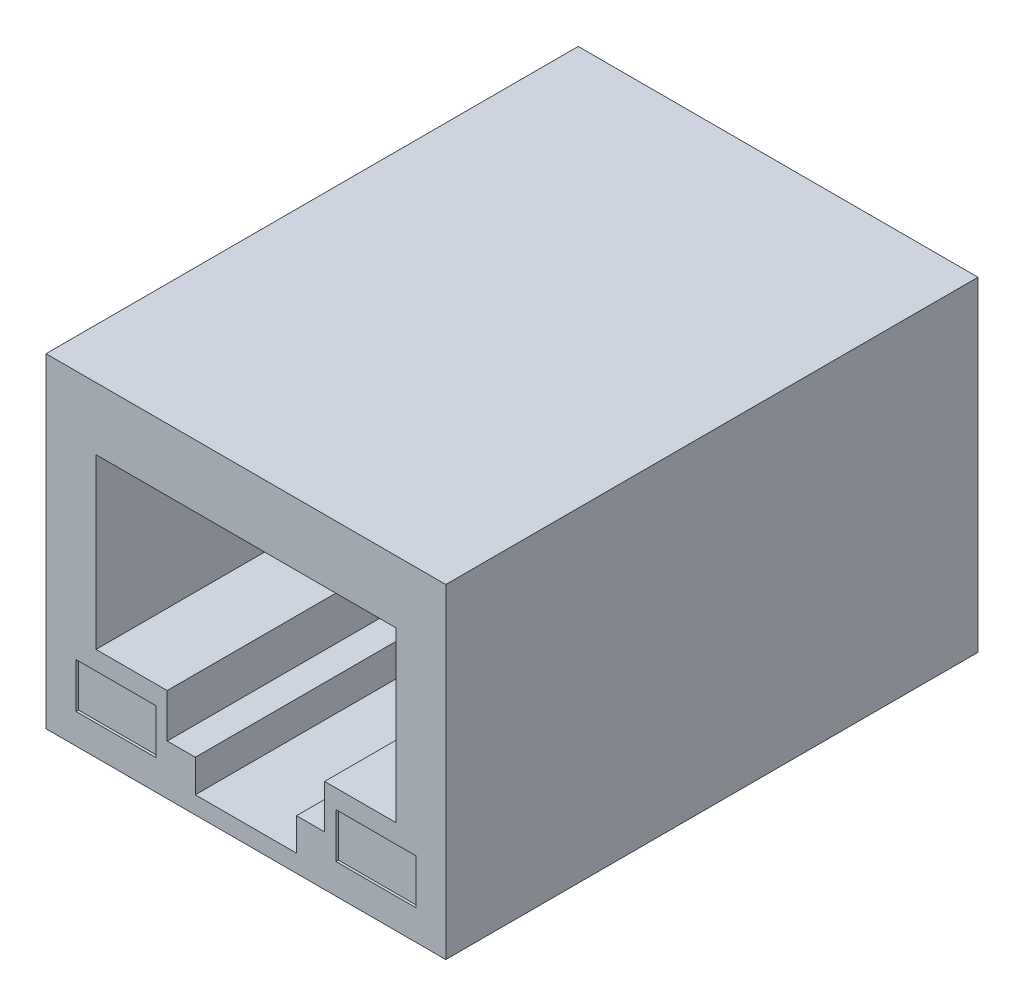
ISO-10303-21;
HEADER;
FILE_DESCRIPTION(('STEP AP214'),'2;1');
FILE_NAME('part.step','',(''),(''),'','','');
FILE_SCHEMA(('AUTOMOTIVE_DESIGN { 1 0 10303 214 1 1 1 1 }'));
ENDSEC;
DATA;
#1=APPLICATION_CONTEXT('core data for automotive mechanical design processes');
#2=APPLICATION_PROTOCOL_DEFINITION('international standard','automotive_design',2000,#1);
#3=PRODUCT_CONTEXT('',#1,'mechanical');
#4=PRODUCT('Part','Part','',(#3));
#5=PRODUCT_RELATED_PRODUCT_CATEGORY('part','',(#4));
#6=PRODUCT_DEFINITION_FORMATION('','',#4);
#7=PRODUCT_DEFINITION_CONTEXT('part definition',#1,'design');
#8=PRODUCT_DEFINITION('design','',#6,#7);
#9=PRODUCT_DEFINITION_SHAPE('','',#8);
#10=(LENGTH_UNIT() NAMED_UNIT(*) SI_UNIT(.MILLI.,.METRE.));
#11=(NAMED_UNIT(*) PLANE_ANGLE_UNIT() SI_UNIT($,.RADIAN.));
#12=(NAMED_UNIT(*) SI_UNIT($,.STERADIAN.) SOLID_ANGLE_UNIT());
#13=UNCERTAINTY_MEASURE_WITH_UNIT(LENGTH_MEASURE(1.E-05),#10,'distance_accuracy_value','');
#14=(GEOMETRIC_REPRESENTATION_CONTEXT(3) GLOBAL_UNCERTAINTY_ASSIGNED_CONTEXT((#13)) GLOBAL_UNIT_ASSIGNED_CONTEXT((#10,
#11,#12)) REPRESENTATION_CONTEXT('',''));
#15=CARTESIAN_POINT('',(0.,0.,0.));
#16=DIRECTION('',(0.,0.,1.));
#17=DIRECTION('',(1.,0.,0.));
#18=AXIS2_PLACEMENT_3D('',#15,#16,#17);
#19=CARTESIAN_POINT('',(-5.2,-8.4,-0.1));
#20=DIRECTION('',(0.,0.,1.));
#21=DIRECTION('',(1.,0.,0.));
#22=AXIS2_PLACEMENT_3D('',#19,#20,#21);
#23=PLANE('',#22);
#24=DIRECTION('',(0.,1.,0.));
#25=VECTOR('',#24,1.);
#26=CARTESIAN_POINT('',(-3.59999999999999,-9.3,-0.1));
#27=LINE('',#26,#25);
#28=CARTESIAN_POINT('',(-3.59999999999999,-9.3,-0.1));
#29=VERTEX_POINT('',#28);
#30=CARTESIAN_POINT('',(-3.59999999999999,-7.5,-0.1));
#31=VERTEX_POINT('',#30);
#32=EDGE_CURVE('E225',#29,#31,#27,.T.);
#33=ORIENTED_EDGE('',*,*,#32,.T.);
#34=DIRECTION('',(1.,0.,0.));
#35=VECTOR('',#34,1.);
#36=CARTESIAN_POINT('',(-3.59999999999999,-7.5,-0.1));
#37=LINE('',#36,#35);
#38=CARTESIAN_POINT('',(-6.8,-7.5,-0.1));
#39=VERTEX_POINT('',#38);
#40=EDGE_CURVE('E220',#31,#39,#37,.F.);
#41=ORIENTED_EDGE('',*,*,#40,.T.);
#42=DIRECTION('',(0.,1.,0.));
#43=VECTOR('',#42,1.);
#44=CARTESIAN_POINT('',(-6.8,-7.5,-0.1));
#45=LINE('',#44,#43);
#46=CARTESIAN_POINT('',(-6.8,-9.3,-0.1));
#47=VERTEX_POINT('',#46);
#48=EDGE_CURVE('E216',#39,#47,#45,.F.);
#49=ORIENTED_EDGE('',*,*,#48,.T.);
#50=DIRECTION('',(1.,0.,0.));
#51=VECTOR('',#50,1.);
#52=CARTESIAN_POINT('',(-6.8,-9.3,-0.1));
#53=LINE('',#52,#51);
#54=EDGE_CURVE('E233',#47,#29,#53,.T.);
#55=ORIENTED_EDGE('',*,*,#54,.T.);
#56=EDGE_LOOP('',(#33,#41,#49,#55));
#57=FACE_BOUND('',#56,.T.);
#58=ADVANCED_FACE('F16',(#57),#23,.T.);
#59=CARTESIAN_POINT('',(5.2,-8.4,-0.1));
#60=DIRECTION('',(0.,0.,1.));
#61=DIRECTION('',(1.,0.,0.));
#62=AXIS2_PLACEMENT_3D('',#59,#60,#61);
#63=PLANE('',#62);
#64=DIRECTION('',(0.,1.,0.));
#65=VECTOR('',#64,1.);
#66=CARTESIAN_POINT('',(6.8,-9.3,-0.1));
#67=LINE('',#66,#65);
#68=CARTESIAN_POINT('',(6.8,-9.3,-0.1));
#69=VERTEX_POINT('',#68);
#70=CARTESIAN_POINT('',(6.8,-7.5,-0.1));
#71=VERTEX_POINT('',#70);
#72=EDGE_CURVE('E245',#69,#71,#67,.T.);
#73=ORIENTED_EDGE('',*,*,#72,.T.);
#74=DIRECTION('',(1.,0.,0.));
#75=VECTOR('',#74,1.);
#76=CARTESIAN_POINT('',(6.8,-7.5,-0.1));
#77=LINE('',#76,#75);
#78=CARTESIAN_POINT('',(3.6,-7.5,-0.1));
#79=VERTEX_POINT('',#78);
#80=EDGE_CURVE('E240',#71,#79,#77,.F.);
#81=ORIENTED_EDGE('',*,*,#80,.T.);
#82=DIRECTION('',(0.,1.,0.));
#83=VECTOR('',#82,1.);
#84=CARTESIAN_POINT('',(3.6,-7.5,-0.1));
#85=LINE('',#84,#83);
#86=CARTESIAN_POINT('',(3.6,-9.3,-0.1));
#87=VERTEX_POINT('',#86);
#88=EDGE_CURVE('E236',#79,#87,#85,.F.);
#89=ORIENTED_EDGE('',*,*,#88,.T.);
#90=DIRECTION('',(1.,0.,0.));
#91=VECTOR('',#90,1.);
#92=CARTESIAN_POINT('',(3.6,-9.3,-0.1));
#93=LINE('',#92,#91);
#94=EDGE_CURVE('E253',#87,#69,#93,.T.);
#95=ORIENTED_EDGE('',*,*,#94,.T.);
#96=EDGE_LOOP('',(#73,#81,#89,#95));
#97=FACE_BOUND('',#96,.T.);
#98=ADVANCED_FACE('F644',(#97),#63,.T.);
#99=CARTESIAN_POINT('',(2.025,-8.5,0.));
#100=DIRECTION('',(0.,-1.,0.));
#101=DIRECTION('',(0.,0.,-1.));
#102=AXIS2_PLACEMENT_3D('',#99,#100,#101);
#103=PLANE('',#102);
#104=DIRECTION('',(0.,0.,-1.));
#105=VECTOR('',#104,1.);
#106=CARTESIAN_POINT('',(2.025,-8.5,0.));
#107=LINE('',#106,#105);
#108=CARTESIAN_POINT('',(2.025,-8.5,-10.7));
#109=VERTEX_POINT('',#108);
#110=CARTESIAN_POINT('',(2.025,-8.5,0.));
#111=VERTEX_POINT('',#110);
#112=EDGE_CURVE('E189',#109,#111,#107,.F.);
#113=ORIENTED_EDGE('',*,*,#112,.T.);
#114=DIRECTION('',(1.,0.,0.));
#115=VECTOR('',#114,1.);
#116=CARTESIAN_POINT('',(2.025,-8.5,0.));
#117=LINE('',#116,#115);
#118=CARTESIAN_POINT('',(3.15,-8.5,0.));
#119=VERTEX_POINT('',#118);
#120=EDGE_CURVE('E19',#119,#111,#117,.F.);
#121=ORIENTED_EDGE('',*,*,#120,.F.);
#122=DIRECTION('',(0.,0.,-1.));
#123=VECTOR('',#122,1.);
#124=CARTESIAN_POINT('',(3.15,-8.5,0.));
#125=LINE('',#124,#123);
#126=CARTESIAN_POINT('',(3.15,-8.5,-10.7));
#127=VERTEX_POINT('',#126);
#128=EDGE_CURVE('E275',#119,#127,#125,.T.);
#129=ORIENTED_EDGE('',*,*,#128,.T.);
#130=DIRECTION('',(1.,0.,0.));
#131=VECTOR('',#130,1.);
#132=CARTESIAN_POINT('',(0.,-8.5,-10.7));
#133=LINE('',#132,#131);
#134=EDGE_CURVE('E193',#109,#127,#133,.T.);
#135=ORIENTED_EDGE('',*,*,#134,.F.);
#136=EDGE_LOOP('',(#113,#121,#129,#135));
#137=FACE_BOUND('',#136,.T.);
#138=ADVANCED_FACE('F191',(#137),#103,.F.);
#139=CARTESIAN_POINT('',(2.025,-9.8,0.));
#140=DIRECTION('',(1.,0.,0.));
#141=DIRECTION('',(0.,0.,-1.));
#142=AXIS2_PLACEMENT_3D('',#139,#140,#141);
#143=PLANE('',#142);
#144=DIRECTION('',(0.,0.,-1.));
#145=VECTOR('',#144,1.);
#146=CARTESIAN_POINT('',(2.025,-9.8,0.));
#147=LINE('',#146,#145);
#148=CARTESIAN_POINT('',(2.025,-9.8,-10.7));
#149=VERTEX_POINT('',#148);
#150=CARTESIAN_POINT('',(2.025,-9.8,0.));
#151=VERTEX_POINT('',#150);
#152=EDGE_CURVE('E198',#149,#151,#147,.F.);
#153=ORIENTED_EDGE('',*,*,#152,.T.);
#154=DIRECTION('',(0.,1.,0.));
#155=VECTOR('',#154,1.);
#156=CARTESIAN_POINT('',(2.025,-9.8,0.));
#157=LINE('',#156,#155);
#158=EDGE_CURVE('E182',#111,#151,#157,.F.);
#159=ORIENTED_EDGE('',*,*,#158,.F.);
#160=ORIENTED_EDGE('',*,*,#112,.F.);
#161=DIRECTION('',(0.,1.,0.));
#162=VECTOR('',#161,1.);
#163=CARTESIAN_POINT('',(2.025,-4.4341743119266,-10.7));
#164=LINE('',#163,#162);
#165=EDGE_CURVE('E213',#149,#109,#164,.T.);
#166=ORIENTED_EDGE('',*,*,#165,.F.);
#167=EDGE_LOOP('',(#153,#159,#160,#166));
#168=FACE_BOUND('',#167,.T.);
#169=ADVANCED_FACE('F196',(#168),#143,.F.);
#170=CARTESIAN_POINT('',(-2.025,-8.5,0.));
#171=DIRECTION('',(-1.,0.,0.));
#172=DIRECTION('',(0.,0.,1.));
#173=AXIS2_PLACEMENT_3D('',#170,#171,#172);
#174=PLANE('',#173);
#175=DIRECTION('',(0.,0.,-1.));
#176=VECTOR('',#175,1.);
#177=CARTESIAN_POINT('',(-2.025,-8.5,0.));
#178=LINE('',#177,#176);
#179=CARTESIAN_POINT('',(-2.025,-8.5,-10.7));
#180=VERTEX_POINT('',#179);
#181=CARTESIAN_POINT('',(-2.025,-8.5,0.));
#182=VERTEX_POINT('',#181);
#183=EDGE_CURVE('E201',#180,#182,#178,.F.);
#184=ORIENTED_EDGE('',*,*,#183,.T.);
#185=DIRECTION('',(0.,1.,0.));
#186=VECTOR('',#185,1.);
#187=CARTESIAN_POINT('',(-2.025,-8.5,0.));
#188=LINE('',#187,#186);
#189=CARTESIAN_POINT('',(-2.025,-9.8,0.));
#190=VERTEX_POINT('',#189);
#191=EDGE_CURVE('E173',#190,#182,#188,.T.);
#192=ORIENTED_EDGE('',*,*,#191,.F.);
#193=DIRECTION('',(0.,0.,-1.));
#194=VECTOR('',#193,1.);
#195=CARTESIAN_POINT('',(-2.025,-9.8,0.));
#196=LINE('',#195,#194);
#197=CARTESIAN_POINT('',(-2.025,-9.8,-10.7));
#198=VERTEX_POINT('',#197);
#199=EDGE_CURVE('E281',#190,#198,#196,.T.);
#200=ORIENTED_EDGE('',*,*,#199,.T.);
#201=DIRECTION('',(0.,1.,0.));
#202=VECTOR('',#201,1.);
#203=CARTESIAN_POINT('',(-2.025,-4.4341743119266,-10.7));
#204=LINE('',#203,#202);
#205=EDGE_CURVE('E210',#180,#198,#204,.F.);
#206=ORIENTED_EDGE('',*,*,#205,.F.);
#207=EDGE_LOOP('',(#184,#192,#200,#206));
#208=FACE_BOUND('',#207,.T.);
#209=ADVANCED_FACE('F617',(#208),#174,.F.);
#210=CARTESIAN_POINT('',(-3.15,-8.5,0.));
#211=DIRECTION('',(0.,-1.,0.));
#212=DIRECTION('',(0.,0.,-1.));
#213=AXIS2_PLACEMENT_3D('',#210,#211,#212);
#214=PLANE('',#213);
#215=DIRECTION('',(0.,0.,1.));
#216=VECTOR('',#215,1.);
#217=CARTESIAN_POINT('',(-3.15,-8.5,0.));
#218=LINE('',#217,#216);
#219=CARTESIAN_POINT('',(-3.15,-8.5,-10.7));
#220=VERTEX_POINT('',#219);
#221=CARTESIAN_POINT('',(-3.15,-8.5,0.));
#222=VERTEX_POINT('',#221);
#223=EDGE_CURVE('E286',#220,#222,#218,.T.);
#224=ORIENTED_EDGE('',*,*,#223,.T.);
#225=DIRECTION('',(1.,0.,0.));
#226=VECTOR('',#225,1.);
#227=CARTESIAN_POINT('',(-3.15,-8.5,0.));
#228=LINE('',#227,#226);
#229=EDGE_CURVE('E205',#182,#222,#228,.F.);
#230=ORIENTED_EDGE('',*,*,#229,.F.);
#231=ORIENTED_EDGE('',*,*,#183,.F.);
#232=DIRECTION('',(1.,0.,0.));
#233=VECTOR('',#232,1.);
#234=CARTESIAN_POINT('',(0.,-8.5,-10.7));
#235=LINE('',#234,#233);
#236=EDGE_CURVE('E207',#220,#180,#235,.T.);
#237=ORIENTED_EDGE('',*,*,#236,.F.);
#238=EDGE_LOOP('',(#224,#230,#231,#237));
#239=FACE_BOUND('',#238,.T.);
#240=ADVANCED_FACE('F607',(#239),#214,.F.);
#241=CARTESIAN_POINT('',(0.,-4.4341743119266,-10.7));
#242=DIRECTION('',(0.,0.,1.));
#243=DIRECTION('',(1.,0.,0.));
#244=AXIS2_PLACEMENT_3D('',#241,#242,#243);
#245=PLANE('',#244);
#246=DIRECTION('',(0.,1.,0.));
#247=VECTOR('',#246,1.);
#248=CARTESIAN_POINT('',(6.,-6.75,-10.7));
#249=LINE('',#248,#247);
#250=CARTESIAN_POINT('',(6.,-6.75,-10.7));
#251=VERTEX_POINT('',#250);
#252=CARTESIAN_POINT('',(6.00000000000001,0.,-10.7));
#253=VERTEX_POINT('',#252);
#254=EDGE_CURVE('E265',#251,#253,#249,.T.);
#255=ORIENTED_EDGE('',*,*,#254,.T.);
#256=DIRECTION('',(1.,0.,0.));
#257=VECTOR('',#256,1.);
#258=CARTESIAN_POINT('',(0.,0.,-10.7));
#259=LINE('',#258,#257);
#260=CARTESIAN_POINT('',(-6.00000000000001,0.,-10.7));
#261=VERTEX_POINT('',#260);
#262=EDGE_CURVE('E260',#253,#261,#259,.F.);
#263=ORIENTED_EDGE('',*,*,#262,.T.);
#264=DIRECTION('',(0.,1.,0.));
#265=VECTOR('',#264,1.);
#266=CARTESIAN_POINT('',(-6.00000000000001,0.,-10.7));
#267=LINE('',#266,#265);
#268=CARTESIAN_POINT('',(-6.00000000000001,-6.75,-10.7));
#269=VERTEX_POINT('',#268);
#270=EDGE_CURVE('E256',#261,#269,#267,.F.);
#271=ORIENTED_EDGE('',*,*,#270,.T.);
#272=DIRECTION('',(1.,0.,0.));
#273=VECTOR('',#272,1.);
#274=CARTESIAN_POINT('',(-6.,-6.75,-10.7));
#275=LINE('',#274,#273);
#276=CARTESIAN_POINT('',(-3.15,-6.75,-10.7));
#277=VERTEX_POINT('',#276);
#278=EDGE_CURVE('E297',#269,#277,#275,.T.);
#279=ORIENTED_EDGE('',*,*,#278,.T.);
#280=DIRECTION('',(0.,1.,0.));
#281=VECTOR('',#280,1.);
#282=CARTESIAN_POINT('',(-3.15,-6.75,-10.7));
#283=LINE('',#282,#281);
#284=EDGE_CURVE('E289',#277,#220,#283,.F.);
#285=ORIENTED_EDGE('',*,*,#284,.T.);
#286=ORIENTED_EDGE('',*,*,#236,.T.);
#287=ORIENTED_EDGE('',*,*,#205,.T.);
#288=DIRECTION('',(1.,0.,0.));
#289=VECTOR('',#288,1.);
#290=CARTESIAN_POINT('',(-2.025,-9.8,-10.7));
#291=LINE('',#290,#289);
#292=EDGE_CURVE('E283',#198,#149,#291,.T.);
#293=ORIENTED_EDGE('',*,*,#292,.T.);
#294=ORIENTED_EDGE('',*,*,#165,.T.);
#295=ORIENTED_EDGE('',*,*,#134,.T.);
#296=DIRECTION('',(0.,1.,0.));
#297=VECTOR('',#296,1.);
#298=CARTESIAN_POINT('',(3.15,-8.5,-10.7));
#299=LINE('',#298,#297);
#300=CARTESIAN_POINT('',(3.15,-6.75,-10.7));
#301=VERTEX_POINT('',#300);
#302=EDGE_CURVE('E277',#127,#301,#299,.T.);
#303=ORIENTED_EDGE('',*,*,#302,.T.);
#304=DIRECTION('',(1.,0.,0.));
#305=VECTOR('',#304,1.);
#306=CARTESIAN_POINT('',(3.15,-6.75,-10.7));
#307=LINE('',#306,#305);
#308=EDGE_CURVE('E270',#301,#251,#307,.T.);
#309=ORIENTED_EDGE('',*,*,#308,.T.);
#310=EDGE_LOOP('',(#255,#263,#271,#279,#285,#286,#287,#293,#294,#295,#303,#309));
#311=FACE_BOUND('',#310,.T.);
#312=ADVANCED_FACE('F597',(#311),#245,.T.);
#313=CARTESIAN_POINT('',(-6.8,-7.5,0.));
#314=DIRECTION('',(-1.,0.,0.));
#315=DIRECTION('',(0.,0.,1.));
#316=AXIS2_PLACEMENT_3D('',#313,#314,#315);
#317=PLANE('',#316);
#318=DIRECTION('',(0.,0.,1.));
#319=VECTOR('',#318,1.);
#320=CARTESIAN_POINT('',(-6.8,-7.5,0.));
#321=LINE('',#320,#319);
#322=CARTESIAN_POINT('',(-6.8,-7.5,0.));
#323=VERTEX_POINT('',#322);
#324=EDGE_CURVE('E218',#39,#323,#321,.T.);
#325=ORIENTED_EDGE('',*,*,#324,.T.);
#326=DIRECTION('',(0.,1.,0.));
#327=VECTOR('',#326,1.);
#328=CARTESIAN_POINT('',(-6.8,-4.,0.));
#329=LINE('',#328,#327);
#330=CARTESIAN_POINT('',(-6.8,-9.3,0.));
#331=VERTEX_POINT('',#330);
#332=EDGE_CURVE('E312',#331,#323,#329,.T.);
#333=ORIENTED_EDGE('',*,*,#332,.F.);
#334=DIRECTION('',(0.,0.,-1.));
#335=VECTOR('',#334,1.);
#336=CARTESIAN_POINT('',(-6.8,-9.3,0.));
#337=LINE('',#336,#335);
#338=EDGE_CURVE('E230',#331,#47,#337,.T.);
#339=ORIENTED_EDGE('',*,*,#338,.T.);
#340=ORIENTED_EDGE('',*,*,#48,.F.);
#341=EDGE_LOOP('',(#325,#333,#339,#340));
#342=FACE_BOUND('',#341,.T.);
#343=ADVANCED_FACE('F587',(#342),#317,.F.);
#344=CARTESIAN_POINT('',(-3.59999999999999,-7.5,0.));
#345=DIRECTION('',(0.,1.,0.));
#346=DIRECTION('',(0.,0.,1.));
#347=AXIS2_PLACEMENT_3D('',#344,#345,#346);
#348=PLANE('',#347);
#349=DIRECTION('',(0.,0.,-1.));
#350=VECTOR('',#349,1.);
#351=CARTESIAN_POINT('',(-3.59999999999999,-7.5,0.));
#352=LINE('',#351,#350);
#353=CARTESIAN_POINT('',(-3.59999999999999,-7.5,0.));
#354=VERTEX_POINT('',#353);
#355=EDGE_CURVE('E223',#31,#354,#352,.F.);
#356=ORIENTED_EDGE('',*,*,#355,.T.);
#357=DIRECTION('',(1.,0.,0.));
#358=VECTOR('',#357,1.);
#359=CARTESIAN_POINT('',(0.,-7.5,0.));
#360=LINE('',#359,#358);
#361=EDGE_CURVE('E315',#323,#354,#360,.T.);
#362=ORIENTED_EDGE('',*,*,#361,.F.);
#363=ORIENTED_EDGE('',*,*,#324,.F.);
#364=ORIENTED_EDGE('',*,*,#40,.F.);
#365=EDGE_LOOP('',(#356,#362,#363,#364));
#366=FACE_BOUND('',#365,.T.);
#367=ADVANCED_FACE('F577',(#366),#348,.F.);
#368=CARTESIAN_POINT('',(-3.59999999999999,-9.3,0.));
#369=DIRECTION('',(1.,0.,0.));
#370=DIRECTION('',(0.,0.,-1.));
#371=AXIS2_PLACEMENT_3D('',#368,#369,#370);
#372=PLANE('',#371);
#373=DIRECTION('',(0.,0.,-1.));
#374=VECTOR('',#373,1.);
#375=CARTESIAN_POINT('',(-3.59999999999999,-9.3,0.));
#376=LINE('',#375,#374);
#377=CARTESIAN_POINT('',(-3.59999999999999,-9.3,0.));
#378=VERTEX_POINT('',#377);
#379=EDGE_CURVE('E228',#29,#378,#376,.F.);
#380=ORIENTED_EDGE('',*,*,#379,.T.);
#381=DIRECTION('',(0.,1.,0.));
#382=VECTOR('',#381,1.);
#383=CARTESIAN_POINT('',(-3.59999999999999,-4.,0.));
#384=LINE('',#383,#382);
#385=EDGE_CURVE('E318',#354,#378,#384,.F.);
#386=ORIENTED_EDGE('',*,*,#385,.F.);
#387=ORIENTED_EDGE('',*,*,#355,.F.);
#388=ORIENTED_EDGE('',*,*,#32,.F.);
#389=EDGE_LOOP('',(#380,#386,#387,#388));
#390=FACE_BOUND('',#389,.T.);
#391=ADVANCED_FACE('F567',(#390),#372,.F.);
#392=CARTESIAN_POINT('',(-6.8,-9.3,0.));
#393=DIRECTION('',(0.,-1.,0.));
#394=DIRECTION('',(0.,0.,-1.));
#395=AXIS2_PLACEMENT_3D('',#392,#393,#394);
#396=PLANE('',#395);
#397=ORIENTED_EDGE('',*,*,#338,.F.);
#398=DIRECTION('',(1.,0.,0.));
#399=VECTOR('',#398,1.);
#400=CARTESIAN_POINT('',(0.,-9.3,0.));
#401=LINE('',#400,#399);
#402=EDGE_CURVE('E321',#378,#331,#401,.F.);
#403=ORIENTED_EDGE('',*,*,#402,.F.);
#404=ORIENTED_EDGE('',*,*,#379,.F.);
#405=ORIENTED_EDGE('',*,*,#54,.F.);
#406=EDGE_LOOP('',(#397,#403,#404,#405));
#407=FACE_BOUND('',#406,.T.);
#408=ADVANCED_FACE('F557',(#407),#396,.F.);
#409=CARTESIAN_POINT('',(3.6,-7.5,0.));
#410=DIRECTION('',(-1.,0.,0.));
#411=DIRECTION('',(0.,0.,1.));
#412=AXIS2_PLACEMENT_3D('',#409,#410,#411);
#413=PLANE('',#412);
#414=DIRECTION('',(0.,0.,1.));
#415=VECTOR('',#414,1.);
#416=CARTESIAN_POINT('',(3.6,-7.5,0.));
#417=LINE('',#416,#415);
#418=CARTESIAN_POINT('',(3.6,-7.5,0.));
#419=VERTEX_POINT('',#418);
#420=EDGE_CURVE('E238',#79,#419,#417,.T.);
#421=ORIENTED_EDGE('',*,*,#420,.T.);
#422=DIRECTION('',(0.,1.,0.));
#423=VECTOR('',#422,1.);
#424=CARTESIAN_POINT('',(3.6,-4.,0.));
#425=LINE('',#424,#423);
#426=CARTESIAN_POINT('',(3.6,-9.3,0.));
#427=VERTEX_POINT('',#426);
#428=EDGE_CURVE('E324',#427,#419,#425,.T.);
#429=ORIENTED_EDGE('',*,*,#428,.F.);
#430=DIRECTION('',(0.,0.,-1.));
#431=VECTOR('',#430,1.);
#432=CARTESIAN_POINT('',(3.6,-9.3,0.));
#433=LINE('',#432,#431);
#434=EDGE_CURVE('E250',#427,#87,#433,.T.);
#435=ORIENTED_EDGE('',*,*,#434,.T.);
#436=ORIENTED_EDGE('',*,*,#88,.F.);
#437=EDGE_LOOP('',(#421,#429,#435,#436));
#438=FACE_BOUND('',#437,.T.);
#439=ADVANCED_FACE('F547',(#438),#413,.F.);
#440=CARTESIAN_POINT('',(6.8,-7.5,0.));
#441=DIRECTION('',(0.,1.,0.));
#442=DIRECTION('',(0.,0.,1.));
#443=AXIS2_PLACEMENT_3D('',#440,#441,#442);
#444=PLANE('',#443);
#445=DIRECTION('',(0.,0.,-1.));
#446=VECTOR('',#445,1.);
#447=CARTESIAN_POINT('',(6.8,-7.5,0.));
#448=LINE('',#447,#446);
#449=CARTESIAN_POINT('',(6.8,-7.5,0.));
#450=VERTEX_POINT('',#449);
#451=EDGE_CURVE('E243',#71,#450,#448,.F.);
#452=ORIENTED_EDGE('',*,*,#451,.T.);
#453=DIRECTION('',(1.,0.,0.));
#454=VECTOR('',#453,1.);
#455=CARTESIAN_POINT('',(0.,-7.5,0.));
#456=LINE('',#455,#454);
#457=EDGE_CURVE('E327',#419,#450,#456,.T.);
#458=ORIENTED_EDGE('',*,*,#457,.F.);
#459=ORIENTED_EDGE('',*,*,#420,.F.);
#460=ORIENTED_EDGE('',*,*,#80,.F.);
#461=EDGE_LOOP('',(#452,#458,#459,#460));
#462=FACE_BOUND('',#461,.T.);
#463=ADVANCED_FACE('F537',(#462),#444,.F.);
#464=CARTESIAN_POINT('',(6.8,-9.3,0.));
#465=DIRECTION('',(1.,0.,0.));
#466=DIRECTION('',(0.,0.,-1.));
#467=AXIS2_PLACEMENT_3D('',#464,#465,#466);
#468=PLANE('',#467);
#469=DIRECTION('',(0.,0.,-1.));
#470=VECTOR('',#469,1.);
#471=CARTESIAN_POINT('',(6.8,-9.3,0.));
#472=LINE('',#471,#470);
#473=CARTESIAN_POINT('',(6.8,-9.3,0.));
#474=VERTEX_POINT('',#473);
#475=EDGE_CURVE('E248',#69,#474,#472,.F.);
#476=ORIENTED_EDGE('',*,*,#475,.T.);
#477=DIRECTION('',(0.,1.,0.));
#478=VECTOR('',#477,1.);
#479=CARTESIAN_POINT('',(6.8,-4.,0.));
#480=LINE('',#479,#478);
#481=EDGE_CURVE('E330',#450,#474,#480,.F.);
#482=ORIENTED_EDGE('',*,*,#481,.F.);
#483=ORIENTED_EDGE('',*,*,#451,.F.);
#484=ORIENTED_EDGE('',*,*,#72,.F.);
#485=EDGE_LOOP('',(#476,#482,#483,#484));
#486=FACE_BOUND('',#485,.T.);
#487=ADVANCED_FACE('F527',(#486),#468,.F.);
#488=CARTESIAN_POINT('',(3.6,-9.3,0.));
#489=DIRECTION('',(0.,-1.,0.));
#490=DIRECTION('',(0.,0.,-1.));
#491=AXIS2_PLACEMENT_3D('',#488,#489,#490);
#492=PLANE('',#491);
#493=ORIENTED_EDGE('',*,*,#434,.F.);
#494=DIRECTION('',(1.,0.,0.));
#495=VECTOR('',#494,1.);
#496=CARTESIAN_POINT('',(0.,-9.3,0.));
#497=LINE('',#496,#495);
#498=EDGE_CURVE('E333',#474,#427,#497,.F.);
#499=ORIENTED_EDGE('',*,*,#498,.F.);
#500=ORIENTED_EDGE('',*,*,#475,.F.);
#501=ORIENTED_EDGE('',*,*,#94,.F.);
#502=EDGE_LOOP('',(#493,#499,#500,#501));
#503=FACE_BOUND('',#502,.T.);
#504=ADVANCED_FACE('F517',(#503),#492,.F.);
#505=CARTESIAN_POINT('',(-6.00000000000001,0.,0.));
#506=DIRECTION('',(-1.,0.,0.));
#507=DIRECTION('',(0.,0.,1.));
#508=AXIS2_PLACEMENT_3D('',#505,#506,#507);
#509=PLANE('',#508);
#510=DIRECTION('',(0.,0.,1.));
#511=VECTOR('',#510,1.);
#512=CARTESIAN_POINT('',(-6.00000000000001,0.,0.));
#513=LINE('',#512,#511);
#514=CARTESIAN_POINT('',(-6.00000000000001,0.,0.));
#515=VERTEX_POINT('',#514);
#516=EDGE_CURVE('E258',#261,#515,#513,.T.);
#517=ORIENTED_EDGE('',*,*,#516,.T.);
#518=DIRECTION('',(0.,1.,0.));
#519=VECTOR('',#518,1.);
#520=CARTESIAN_POINT('',(-6.,-4.,0.));
#521=LINE('',#520,#519);
#522=CARTESIAN_POINT('',(-6.00000000000001,-6.75,0.));
#523=VERTEX_POINT('',#522);
#524=EDGE_CURVE('E336',#523,#515,#521,.T.);
#525=ORIENTED_EDGE('',*,*,#524,.F.);
#526=DIRECTION('',(0.,0.,-1.));
#527=VECTOR('',#526,1.);
#528=CARTESIAN_POINT('',(-6.,-6.75,0.));
#529=LINE('',#528,#527);
#530=EDGE_CURVE('E294',#523,#269,#529,.T.);
#531=ORIENTED_EDGE('',*,*,#530,.T.);
#532=ORIENTED_EDGE('',*,*,#270,.F.);
#533=EDGE_LOOP('',(#517,#525,#531,#532));
#534=FACE_BOUND('',#533,.T.);
#535=ADVANCED_FACE('F507',(#534),#509,.F.);
#536=CARTESIAN_POINT('',(0.,0.,0.));
#537=DIRECTION('',(0.,1.,0.));
#538=DIRECTION('',(0.,0.,1.));
#539=AXIS2_PLACEMENT_3D('',#536,#537,#538);
#540=PLANE('',#539);
#541=DIRECTION('',(0.,0.,-1.));
#542=VECTOR('',#541,1.);
#543=CARTESIAN_POINT('',(6.,0.,0.));
#544=LINE('',#543,#542);
#545=CARTESIAN_POINT('',(6.00000000000001,0.,0.));
#546=VERTEX_POINT('',#545);
#547=EDGE_CURVE('E263',#253,#546,#544,.F.);
#548=ORIENTED_EDGE('',*,*,#547,.T.);
#549=DIRECTION('',(1.,0.,0.));
#550=VECTOR('',#549,1.);
#551=CARTESIAN_POINT('',(0.,0.,0.));
#552=LINE('',#551,#550);
#553=EDGE_CURVE('E339',#515,#546,#552,.T.);
#554=ORIENTED_EDGE('',*,*,#553,.F.);
#555=ORIENTED_EDGE('',*,*,#516,.F.);
#556=ORIENTED_EDGE('',*,*,#262,.F.);
#557=EDGE_LOOP('',(#548,#554,#555,#556));
#558=FACE_BOUND('',#557,.T.);
#559=ADVANCED_FACE('F497',(#558),#540,.F.);
#560=CARTESIAN_POINT('',(6.,-6.75,0.));
#561=DIRECTION('',(1.,0.,0.));
#562=DIRECTION('',(0.,0.,-1.));
#563=AXIS2_PLACEMENT_3D('',#560,#561,#562);
#564=PLANE('',#563);
#565=DIRECTION('',(0.,0.,-1.));
#566=VECTOR('',#565,1.);
#567=CARTESIAN_POINT('',(6.,-6.75,0.));
#568=LINE('',#567,#566);
#569=CARTESIAN_POINT('',(6.,-6.75,0.));
#570=VERTEX_POINT('',#569);
#571=EDGE_CURVE('E268',#251,#570,#568,.F.);
#572=ORIENTED_EDGE('',*,*,#571,.T.);
#573=DIRECTION('',(0.,1.,0.));
#574=VECTOR('',#573,1.);
#575=CARTESIAN_POINT('',(6.00000000000001,-4.,0.));
#576=LINE('',#575,#574);
#577=EDGE_CURVE('E342',#546,#570,#576,.F.);
#578=ORIENTED_EDGE('',*,*,#577,.F.);
#579=ORIENTED_EDGE('',*,*,#547,.F.);
#580=ORIENTED_EDGE('',*,*,#254,.F.);
#581=EDGE_LOOP('',(#572,#578,#579,#580));
#582=FACE_BOUND('',#581,.T.);
#583=ADVANCED_FACE('F487',(#582),#564,.F.);
#584=CARTESIAN_POINT('',(3.15,-6.75,0.));
#585=DIRECTION('',(0.,-1.,0.));
#586=DIRECTION('',(0.,0.,-1.));
#587=AXIS2_PLACEMENT_3D('',#584,#585,#586);
#588=PLANE('',#587);
#589=DIRECTION('',(0.,0.,-1.));
#590=VECTOR('',#589,1.);
#591=CARTESIAN_POINT('',(3.15,-6.75,0.));
#592=LINE('',#591,#590);
#593=CARTESIAN_POINT('',(3.15,-6.75,0.));
#594=VERTEX_POINT('',#593);
#595=EDGE_CURVE('E273',#301,#594,#592,.F.);
#596=ORIENTED_EDGE('',*,*,#595,.T.);
#597=DIRECTION('',(1.,0.,0.));
#598=VECTOR('',#597,1.);
#599=CARTESIAN_POINT('',(0.,-6.75,0.));
#600=LINE('',#599,#598);
#601=EDGE_CURVE('E345',#570,#594,#600,.F.);
#602=ORIENTED_EDGE('',*,*,#601,.F.);
#603=ORIENTED_EDGE('',*,*,#571,.F.);
#604=ORIENTED_EDGE('',*,*,#308,.F.);
#605=EDGE_LOOP('',(#596,#602,#603,#604));
#606=FACE_BOUND('',#605,.T.);
#607=ADVANCED_FACE('F477',(#606),#588,.F.);
#608=CARTESIAN_POINT('',(3.15,-8.5,0.));
#609=DIRECTION('',(1.,0.,0.));
#610=DIRECTION('',(0.,0.,-1.));
#611=AXIS2_PLACEMENT_3D('',#608,#609,#610);
#612=PLANE('',#611);
#613=ORIENTED_EDGE('',*,*,#128,.F.);
#614=DIRECTION('',(0.,1.,0.));
#615=VECTOR('',#614,1.);
#616=CARTESIAN_POINT('',(3.15,-4.,0.));
#617=LINE('',#616,#615);
#618=EDGE_CURVE('E186',#594,#119,#617,.F.);
#619=ORIENTED_EDGE('',*,*,#618,.F.);
#620=ORIENTED_EDGE('',*,*,#595,.F.);
#621=ORIENTED_EDGE('',*,*,#302,.F.);
#622=EDGE_LOOP('',(#613,#619,#620,#621));
#623=FACE_BOUND('',#622,.T.);
#624=ADVANCED_FACE('F467',(#623),#612,.F.);
#625=CARTESIAN_POINT('',(-2.025,-9.8,0.));
#626=DIRECTION('',(0.,-1.,0.));
#627=DIRECTION('',(0.,0.,-1.));
#628=AXIS2_PLACEMENT_3D('',#625,#626,#627);
#629=PLANE('',#628);
#630=ORIENTED_EDGE('',*,*,#199,.F.);
#631=DIRECTION('',(1.,0.,0.));
#632=VECTOR('',#631,1.);
#633=CARTESIAN_POINT('',(0.,-9.8,0.));
#634=LINE('',#633,#632);
#635=EDGE_CURVE('E348',#151,#190,#634,.F.);
#636=ORIENTED_EDGE('',*,*,#635,.F.);
#637=ORIENTED_EDGE('',*,*,#152,.F.);
#638=ORIENTED_EDGE('',*,*,#292,.F.);
#639=EDGE_LOOP('',(#630,#636,#637,#638));
#640=FACE_BOUND('',#639,.T.);
#641=ADVANCED_FACE('F457',(#640),#629,.F.);
#642=CARTESIAN_POINT('',(-3.15,-6.75,0.));
#643=DIRECTION('',(-1.,0.,0.));
#644=DIRECTION('',(0.,0.,1.));
#645=AXIS2_PLACEMENT_3D('',#642,#643,#644);
#646=PLANE('',#645);
#647=DIRECTION('',(0.,0.,-1.));
#648=VECTOR('',#647,1.);
#649=CARTESIAN_POINT('',(-3.15,-6.75,0.));
#650=LINE('',#649,#648);
#651=CARTESIAN_POINT('',(-3.15,-6.75,0.));
#652=VERTEX_POINT('',#651);
#653=EDGE_CURVE('E292',#277,#652,#650,.F.);
#654=ORIENTED_EDGE('',*,*,#653,.T.);
#655=DIRECTION('',(0.,1.,0.));
#656=VECTOR('',#655,1.);
#657=CARTESIAN_POINT('',(-3.15,-4.,0.));
#658=LINE('',#657,#656);
#659=EDGE_CURVE('E350',#222,#652,#658,.T.);
#660=ORIENTED_EDGE('',*,*,#659,.F.);
#661=ORIENTED_EDGE('',*,*,#223,.F.);
#662=ORIENTED_EDGE('',*,*,#284,.F.);
#663=EDGE_LOOP('',(#654,#660,#661,#662));
#664=FACE_BOUND('',#663,.T.);
#665=ADVANCED_FACE('F447',(#664),#646,.F.);
#666=CARTESIAN_POINT('',(-6.,-6.75,0.));
#667=DIRECTION('',(0.,-1.,0.));
#668=DIRECTION('',(0.,0.,-1.));
#669=AXIS2_PLACEMENT_3D('',#666,#667,#668);
#670=PLANE('',#669);
#671=ORIENTED_EDGE('',*,*,#530,.F.);
#672=DIRECTION('',(1.,0.,0.));
#673=VECTOR('',#672,1.);
#674=CARTESIAN_POINT('',(0.,-6.75,0.));
#675=LINE('',#674,#673);
#676=EDGE_CURVE('E352',#652,#523,#675,.F.);
#677=ORIENTED_EDGE('',*,*,#676,.F.);
#678=ORIENTED_EDGE('',*,*,#653,.F.);
#679=ORIENTED_EDGE('',*,*,#278,.F.);
#680=EDGE_LOOP('',(#671,#677,#678,#679));
#681=FACE_BOUND('',#680,.T.);
#682=ADVANCED_FACE('F392',(#681),#670,.F.);
#683=CARTESIAN_POINT('',(-7.99999999999999,-10.5,0.));
#684=DIRECTION('',(0.,-1.,0.));
#685=DIRECTION('',(0.,0.,-1.));
#686=AXIS2_PLACEMENT_3D('',#683,#684,#685);
#687=PLANE('',#686);
#688=DIRECTION('',(1.,0.,0.));
#689=VECTOR('',#688,1.);
#690=CARTESIAN_POINT('',(0.,-10.5,0.));
#691=LINE('',#690,#689);
#692=CARTESIAN_POINT('',(-8.,-10.5,0.));
#693=VERTEX_POINT('',#692);
#694=CARTESIAN_POINT('',(8.,-10.5,0.));
#695=VERTEX_POINT('',#694);
#696=EDGE_CURVE('E310',#693,#695,#691,.T.);
#697=ORIENTED_EDGE('',*,*,#696,.F.);
#698=DIRECTION('',(0.,0.,1.));
#699=VECTOR('',#698,1.);
#700=CARTESIAN_POINT('',(-8.,-10.5,0.));
#701=LINE('',#700,#699);
#702=CARTESIAN_POINT('',(-8.,-10.5,-21.3));
#703=VERTEX_POINT('',#702);
#704=EDGE_CURVE('E305',#703,#693,#701,.T.);
#705=ORIENTED_EDGE('',*,*,#704,.F.);
#706=DIRECTION('',(1.,0.,0.));
#707=VECTOR('',#706,1.);
#708=CARTESIAN_POINT('',(0.,-10.5,-21.3));
#709=LINE('',#708,#707);
#710=CARTESIAN_POINT('',(8.,-10.5,-21.3));
#711=VERTEX_POINT('',#710);
#712=EDGE_CURVE('E300',#703,#711,#709,.T.);
#713=ORIENTED_EDGE('',*,*,#712,.T.);
#714=DIRECTION('',(0.,0.,-1.));
#715=VECTOR('',#714,1.);
#716=CARTESIAN_POINT('',(8.,-10.5,0.));
#717=LINE('',#716,#715);
#718=EDGE_CURVE('E359',#695,#711,#717,.T.);
#719=ORIENTED_EDGE('',*,*,#718,.F.);
#720=EDGE_LOOP('',(#697,#705,#713,#719));
#721=FACE_BOUND('',#720,.T.);
#722=ADVANCED_FACE('F378',(#721),#687,.T.);
#723=CARTESIAN_POINT('',(0.,-4.,-21.3));
#724=DIRECTION('',(0.,0.,1.));
#725=DIRECTION('',(1.,0.,0.));
#726=AXIS2_PLACEMENT_3D('',#723,#724,#725);
#727=PLANE('',#726);
#728=DIRECTION('',(1.,0.,0.));
#729=VECTOR('',#728,1.);
#730=CARTESIAN_POINT('',(0.,2.5,-21.3));
#731=LINE('',#730,#729);
#732=CARTESIAN_POINT('',(8.,2.5,-21.3));
#733=VERTEX_POINT('',#732);
#734=CARTESIAN_POINT('',(-8.,2.5,-21.3));
#735=VERTEX_POINT('',#734);
#736=EDGE_CURVE('E362',#733,#735,#731,.F.);
#737=ORIENTED_EDGE('',*,*,#736,.F.);
#738=DIRECTION('',(0.,1.,0.));
#739=VECTOR('',#738,1.);
#740=CARTESIAN_POINT('',(8.,-10.5,-21.3));
#741=LINE('',#740,#739);
#742=EDGE_CURVE('E355',#711,#733,#741,.T.);
#743=ORIENTED_EDGE('',*,*,#742,.F.);
#744=ORIENTED_EDGE('',*,*,#712,.F.);
#745=DIRECTION('',(0.,1.,0.));
#746=VECTOR('',#745,1.);
#747=CARTESIAN_POINT('',(-8.,2.5,-21.3));
#748=LINE('',#747,#746);
#749=EDGE_CURVE('E302',#735,#703,#748,.F.);
#750=ORIENTED_EDGE('',*,*,#749,.F.);
#751=EDGE_LOOP('',(#737,#743,#744,#750));
#752=FACE_BOUND('',#751,.T.);
#753=ADVANCED_FACE('F383',(#752),#727,.F.);
#754=CARTESIAN_POINT('',(-8.,2.5,0.));
#755=DIRECTION('',(-1.,0.,0.));
#756=DIRECTION('',(0.,0.,1.));
#757=AXIS2_PLACEMENT_3D('',#754,#755,#756);
#758=PLANE('',#757);
#759=DIRECTION('',(0.,1.,0.));
#760=VECTOR('',#759,1.);
#761=CARTESIAN_POINT('',(-8.,-4.,0.));
#762=LINE('',#761,#760);
#763=CARTESIAN_POINT('',(-8.,2.5,0.));
#764=VERTEX_POINT('',#763);
#765=EDGE_CURVE('E307',#764,#693,#762,.F.);
#766=ORIENTED_EDGE('',*,*,#765,.F.);
#767=DIRECTION('',(0.,0.,1.));
#768=VECTOR('',#767,1.);
#769=CARTESIAN_POINT('',(-8.,2.5,0.));
#770=LINE('',#769,#768);
#771=EDGE_CURVE('E365',#735,#764,#770,.T.);
#772=ORIENTED_EDGE('',*,*,#771,.F.);
#773=ORIENTED_EDGE('',*,*,#749,.T.);
#774=ORIENTED_EDGE('',*,*,#704,.T.);
#775=EDGE_LOOP('',(#766,#772,#773,#774));
#776=FACE_BOUND('',#775,.T.);
#777=ADVANCED_FACE('F375',(#776),#758,.T.);
#778=CARTESIAN_POINT('',(0.,-4.,0.));
#779=DIRECTION('',(0.,0.,1.));
#780=DIRECTION('',(1.,0.,0.));
#781=AXIS2_PLACEMENT_3D('',#778,#779,#780);
#782=PLANE('',#781);
#783=ORIENTED_EDGE('',*,*,#659,.T.);
#784=ORIENTED_EDGE('',*,*,#676,.T.);
#785=ORIENTED_EDGE('',*,*,#524,.T.);
#786=ORIENTED_EDGE('',*,*,#553,.T.);
#787=ORIENTED_EDGE('',*,*,#577,.T.);
#788=ORIENTED_EDGE('',*,*,#601,.T.);
#789=ORIENTED_EDGE('',*,*,#618,.T.);
#790=ORIENTED_EDGE('',*,*,#120,.T.);
#791=ORIENTED_EDGE('',*,*,#158,.T.);
#792=ORIENTED_EDGE('',*,*,#635,.T.);
#793=ORIENTED_EDGE('',*,*,#191,.T.);
#794=ORIENTED_EDGE('',*,*,#229,.T.);
#795=EDGE_LOOP('',(#783,#784,#785,#786,#787,#788,#789,#790,#791,#792,#793,#794));
#796=FACE_BOUND('',#795,.T.);
#797=ORIENTED_EDGE('',*,*,#481,.T.);
#798=ORIENTED_EDGE('',*,*,#498,.T.);
#799=ORIENTED_EDGE('',*,*,#428,.T.);
#800=ORIENTED_EDGE('',*,*,#457,.T.);
#801=EDGE_LOOP('',(#797,#798,#799,#800));
#802=FACE_BOUND('',#801,.T.);
#803=ORIENTED_EDGE('',*,*,#385,.T.);
#804=ORIENTED_EDGE('',*,*,#402,.T.);
#805=ORIENTED_EDGE('',*,*,#332,.T.);
#806=ORIENTED_EDGE('',*,*,#361,.T.);
#807=EDGE_LOOP('',(#803,#804,#805,#806));
#808=FACE_BOUND('',#807,.T.);
#809=ORIENTED_EDGE('',*,*,#696,.T.);
#810=DIRECTION('',(0.,1.,0.));
#811=VECTOR('',#810,1.);
#812=CARTESIAN_POINT('',(8.,-10.5,0.));
#813=LINE('',#812,#811);
#814=CARTESIAN_POINT('',(8.,2.5,0.));
#815=VERTEX_POINT('',#814);
#816=EDGE_CURVE('E34',#815,#695,#813,.F.);
#817=ORIENTED_EDGE('',*,*,#816,.F.);
#818=DIRECTION('',(1.,0.,0.));
#819=VECTOR('',#818,1.);
#820=CARTESIAN_POINT('',(0.,2.5,0.));
#821=LINE('',#820,#819);
#822=EDGE_CURVE('E25',#764,#815,#821,.T.);
#823=ORIENTED_EDGE('',*,*,#822,.F.);
#824=ORIENTED_EDGE('',*,*,#765,.T.);
#825=EDGE_LOOP('',(#809,#817,#823,#824));
#826=FACE_BOUND('',#825,.T.);
#827=ADVANCED_FACE('F179',(#796,#802,#808,#826),#782,.T.);
#828=CARTESIAN_POINT('',(8.,-10.5,0.));
#829=DIRECTION('',(1.,0.,0.));
#830=DIRECTION('',(0.,0.,-1.));
#831=AXIS2_PLACEMENT_3D('',#828,#829,#830);
#832=PLANE('',#831);
#833=ORIENTED_EDGE('',*,*,#816,.T.);
#834=ORIENTED_EDGE('',*,*,#718,.T.);
#835=ORIENTED_EDGE('',*,*,#742,.T.);
#836=DIRECTION('',(0.,0.,1.));
#837=VECTOR('',#836,1.);
#838=CARTESIAN_POINT('',(8.,2.5,0.));
#839=LINE('',#838,#837);
#840=EDGE_CURVE('E10',#815,#733,#839,.F.);
#841=ORIENTED_EDGE('',*,*,#840,.F.);
#842=EDGE_LOOP('',(#833,#834,#835,#841));
#843=FACE_BOUND('',#842,.T.);
#844=ADVANCED_FACE('F381',(#843),#832,.T.);
#845=CARTESIAN_POINT('',(0.,2.5,0.));
#846=DIRECTION('',(0.,1.,0.));
#847=DIRECTION('',(0.,0.,1.));
#848=AXIS2_PLACEMENT_3D('',#845,#846,#847);
#849=PLANE('',#848);
#850=ORIENTED_EDGE('',*,*,#822,.T.);
#851=ORIENTED_EDGE('',*,*,#840,.T.);
#852=ORIENTED_EDGE('',*,*,#736,.T.);
#853=ORIENTED_EDGE('',*,*,#771,.T.);
#854=EDGE_LOOP('',(#850,#851,#852,#853));
#855=FACE_BOUND('',#854,.T.);
#856=ADVANCED_FACE('F370',(#855),#849,.T.);
#857=CLOSED_SHELL('',(#58,#98,#138,#169,#209,#240,#312,#343,#367,#391,#408,#439,#463,#487,#504,
#535,#559,#583,#607,#624,#641,#665,#682,#722,#753,#777,#827,#844,#856));
#858=MANIFOLD_SOLID_BREP('B1',#857);
#859=ADVANCED_BREP_SHAPE_REPRESENTATION('',(#18,#858),#14);
#860=SHAPE_DEFINITION_REPRESENTATION(#9,#859);
ENDSEC;
END-ISO-10303-21;
